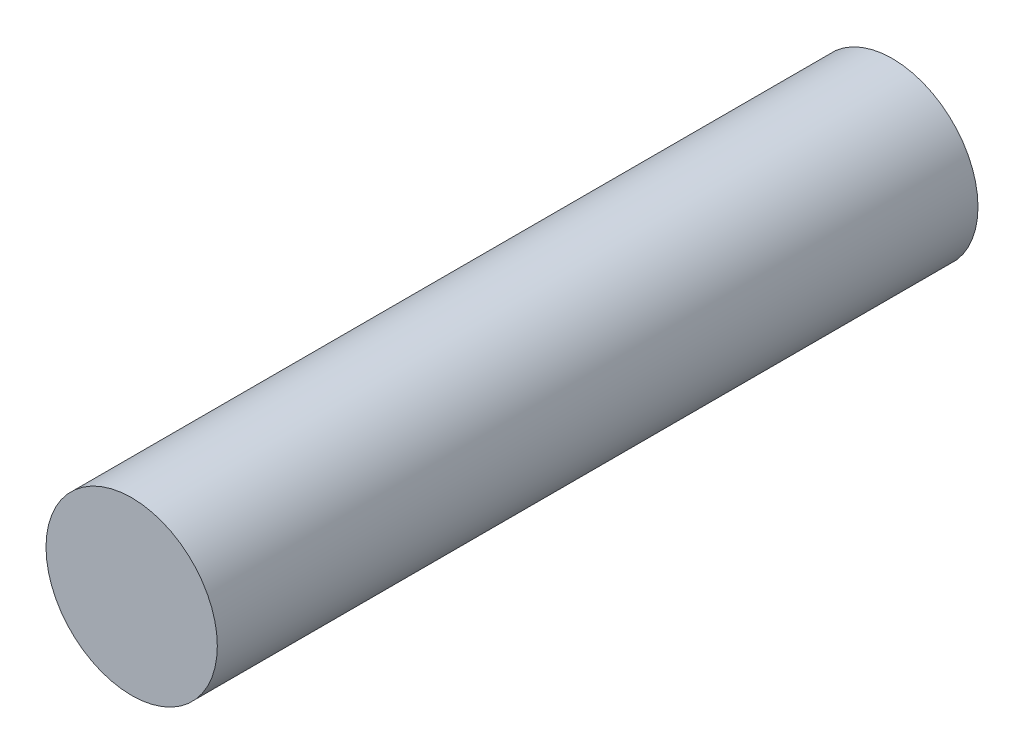
ISO-10303-21;
HEADER;
FILE_DESCRIPTION(('STEP AP214'),'2;1');
FILE_NAME('part.step','',(''),(''),'','','');
FILE_SCHEMA(('AUTOMOTIVE_DESIGN { 1 0 10303 214 1 1 1 1 }'));
ENDSEC;
DATA;
#1=APPLICATION_CONTEXT('core data for automotive mechanical design processes');
#2=APPLICATION_PROTOCOL_DEFINITION('international standard','automotive_design',2000,#1);
#3=PRODUCT_CONTEXT('',#1,'mechanical');
#4=PRODUCT('Part','Part','',(#3));
#5=PRODUCT_RELATED_PRODUCT_CATEGORY('part','',(#4));
#6=PRODUCT_DEFINITION_FORMATION('','',#4);
#7=PRODUCT_DEFINITION_CONTEXT('part definition',#1,'design');
#8=PRODUCT_DEFINITION('design','',#6,#7);
#9=PRODUCT_DEFINITION_SHAPE('','',#8);
#10=(LENGTH_UNIT() NAMED_UNIT(*) SI_UNIT(.MILLI.,.METRE.));
#11=(NAMED_UNIT(*) PLANE_ANGLE_UNIT() SI_UNIT($,.RADIAN.));
#12=(NAMED_UNIT(*) SI_UNIT($,.STERADIAN.) SOLID_ANGLE_UNIT());
#13=UNCERTAINTY_MEASURE_WITH_UNIT(LENGTH_MEASURE(1.E-05),#10,'distance_accuracy_value','');
#14=(GEOMETRIC_REPRESENTATION_CONTEXT(3) GLOBAL_UNCERTAINTY_ASSIGNED_CONTEXT((#13)) GLOBAL_UNIT_ASSIGNED_CONTEXT((#10,
#11,#12)) REPRESENTATION_CONTEXT('',''));
#15=CARTESIAN_POINT('',(0.,0.,0.));
#16=DIRECTION('',(0.,0.,1.));
#17=DIRECTION('',(1.,0.,0.));
#18=AXIS2_PLACEMENT_3D('',#15,#16,#17);
#19=CARTESIAN_POINT('',(0.,0.,6.66));
#20=DIRECTION('',(0.,0.,-1.));
#21=DIRECTION('',(-1.,0.,0.));
#22=AXIS2_PLACEMENT_3D('',#19,#20,#21);
#23=CYLINDRICAL_SURFACE('',#22,0.75);
#24=CARTESIAN_POINT('',(0.,0.,6.66));
#25=DIRECTION('',(0.,0.,1.));
#26=DIRECTION('',(1.,0.,0.));
#27=AXIS2_PLACEMENT_3D('',#24,#25,#26);
#28=CIRCLE('',#27,0.75);
#29=CARTESIAN_POINT('',(0.75,0.,6.66));
#30=VERTEX_POINT('',#29);
#31=EDGE_CURVE('E10',#30,#30,#28,.T.);
#32=ORIENTED_EDGE('',*,*,#31,.F.);
#33=EDGE_LOOP('',(#32));
#34=FACE_BOUND('',#33,.T.);
#35=CARTESIAN_POINT('',(0.,0.,0.));
#36=DIRECTION('',(0.,0.,1.));
#37=DIRECTION('',(1.,0.,0.));
#38=AXIS2_PLACEMENT_3D('',#35,#36,#37);
#39=CIRCLE('',#38,0.75);
#40=CARTESIAN_POINT('',(0.75,0.,0.));
#41=VERTEX_POINT('',#40);
#42=EDGE_CURVE('E34',#41,#41,#39,.T.);
#43=ORIENTED_EDGE('',*,*,#42,.T.);
#44=EDGE_LOOP('',(#43));
#45=FACE_BOUND('',#44,.T.);
#46=ADVANCED_FACE('F31',(#34,#45),#23,.T.);
#47=CARTESIAN_POINT('',(0.,0.,6.66));
#48=DIRECTION('',(0.,0.,1.));
#49=DIRECTION('',(1.,0.,0.));
#50=AXIS2_PLACEMENT_3D('',#47,#48,#49);
#51=PLANE('',#50);
#52=ORIENTED_EDGE('',*,*,#31,.T.);
#53=EDGE_LOOP('',(#52));
#54=FACE_BOUND('',#53,.T.);
#55=ADVANCED_FACE('F46',(#54),#51,.T.);
#56=CARTESIAN_POINT('',(0.,0.,0.));
#57=DIRECTION('',(0.,0.,1.));
#58=DIRECTION('',(1.,0.,0.));
#59=AXIS2_PLACEMENT_3D('',#56,#57,#58);
#60=PLANE('',#59);
#61=ORIENTED_EDGE('',*,*,#42,.F.);
#62=EDGE_LOOP('',(#61));
#63=FACE_BOUND('',#62,.T.);
#64=ADVANCED_FACE('F44',(#63),#60,.F.);
#65=CLOSED_SHELL('',(#46,#55,#64));
#66=MANIFOLD_SOLID_BREP('B2',#65);
#67=ADVANCED_BREP_SHAPE_REPRESENTATION('',(#18,#66),#14);
#68=SHAPE_DEFINITION_REPRESENTATION(#9,#67);
ENDSEC;
END-ISO-10303-21;
